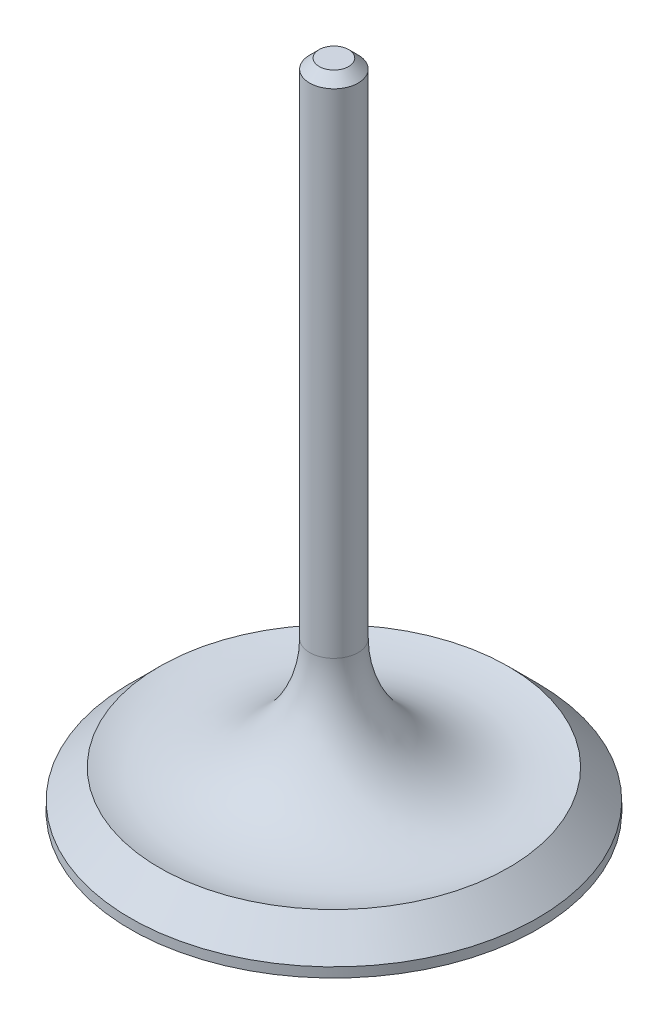
ISO-10303-21;
HEADER;
FILE_DESCRIPTION(('STEP AP214'),'2;1');
FILE_NAME('part.step','',(''),(''),'','','');
FILE_SCHEMA(('AUTOMOTIVE_DESIGN { 1 0 10303 214 1 1 1 1 }'));
ENDSEC;
DATA;
#1=APPLICATION_CONTEXT('core data for automotive mechanical design processes');
#2=APPLICATION_PROTOCOL_DEFINITION('international standard','automotive_design',2000,#1);
#3=PRODUCT_CONTEXT('',#1,'mechanical');
#4=PRODUCT('Part','Part','',(#3));
#5=PRODUCT_RELATED_PRODUCT_CATEGORY('part','',(#4));
#6=PRODUCT_DEFINITION_FORMATION('','',#4);
#7=PRODUCT_DEFINITION_CONTEXT('part definition',#1,'design');
#8=PRODUCT_DEFINITION('design','',#6,#7);
#9=PRODUCT_DEFINITION_SHAPE('','',#8);
#10=(LENGTH_UNIT() NAMED_UNIT(*) SI_UNIT(.MILLI.,.METRE.));
#11=(NAMED_UNIT(*) PLANE_ANGLE_UNIT() SI_UNIT($,.RADIAN.));
#12=(NAMED_UNIT(*) SI_UNIT($,.STERADIAN.) SOLID_ANGLE_UNIT());
#13=UNCERTAINTY_MEASURE_WITH_UNIT(LENGTH_MEASURE(1.E-05),#10,'distance_accuracy_value','');
#14=(GEOMETRIC_REPRESENTATION_CONTEXT(3) GLOBAL_UNCERTAINTY_ASSIGNED_CONTEXT((#13)) GLOBAL_UNIT_ASSIGNED_CONTEXT((#10,
#11,#12)) REPRESENTATION_CONTEXT('',''));
#15=CARTESIAN_POINT('',(0.,0.,0.));
#16=DIRECTION('',(0.,0.,1.));
#17=DIRECTION('',(1.,0.,0.));
#18=AXIS2_PLACEMENT_3D('',#15,#16,#17);
#19=CARTESIAN_POINT('',(0.,0.,-26.67));
#20=DIRECTION('',(0.,-1.,0.));
#21=DIRECTION('',(0.,0.,-1.));
#22=AXIS2_PLACEMENT_3D('',#19,#20,#21);
#23=PLANE('',#22);
#24=CARTESIAN_POINT('',(0.,0.,0.));
#25=DIRECTION('',(0.,-1.,0.));
#26=DIRECTION('',(0.,0.,-1.));
#27=AXIS2_PLACEMENT_3D('',#24,#25,#26);
#28=CIRCLE('',#27,26.67);
#29=CARTESIAN_POINT('',(0.,0.,-26.67));
#30=VERTEX_POINT('',#29);
#31=EDGE_CURVE('E45',#30,#30,#28,.T.);
#32=ORIENTED_EDGE('',*,*,#31,.T.);
#33=EDGE_LOOP('',(#32));
#34=FACE_BOUND('',#33,.T.);
#35=ADVANCED_FACE('F33',(#34),#23,.T.);
#36=CARTESIAN_POINT('',(0.,0.,0.));
#37=DIRECTION('',(0.,-1.,0.));
#38=DIRECTION('',(0.,0.,-1.));
#39=AXIS2_PLACEMENT_3D('',#36,#37,#38);
#40=CYLINDRICAL_SURFACE('',#39,26.67);
#41=CARTESIAN_POINT('',(0.,1.27,0.));
#42=DIRECTION('',(0.,-1.,0.));
#43=DIRECTION('',(0.,0.,-1.));
#44=AXIS2_PLACEMENT_3D('',#41,#42,#43);
#45=CIRCLE('',#44,26.67);
#46=CARTESIAN_POINT('',(0.,1.27,-26.67));
#47=VERTEX_POINT('',#46);
#48=EDGE_CURVE('E49',#47,#47,#45,.T.);
#49=ORIENTED_EDGE('',*,*,#48,.T.);
#50=EDGE_LOOP('',(#49));
#51=FACE_BOUND('',#50,.T.);
#52=ORIENTED_EDGE('',*,*,#31,.F.);
#53=EDGE_LOOP('',(#52));
#54=FACE_BOUND('',#53,.T.);
#55=ADVANCED_FACE('F76',(#51,#54),#40,.T.);
#56=CARTESIAN_POINT('',(0.,1.27,0.));
#57=DIRECTION('',(0.,-1.,0.));
#58=DIRECTION('',(0.,0.,-1.));
#59=AXIS2_PLACEMENT_3D('',#56,#57,#58);
#60=CONICAL_SURFACE('',#59,26.67,0.785398163397455);
#61=CARTESIAN_POINT('',(0.,5.08,0.));
#62=DIRECTION('',(0.,-1.,0.));
#63=DIRECTION('',(0.,0.,-1.));
#64=AXIS2_PLACEMENT_3D('',#61,#62,#63);
#65=CIRCLE('',#64,22.86);
#66=CARTESIAN_POINT('',(0.,5.08,-22.86));
#67=VERTEX_POINT('',#66);
#68=EDGE_CURVE('E54',#67,#67,#65,.T.);
#69=ORIENTED_EDGE('',*,*,#68,.T.);
#70=EDGE_LOOP('',(#69));
#71=FACE_BOUND('',#70,.T.);
#72=ORIENTED_EDGE('',*,*,#48,.F.);
#73=EDGE_LOOP('',(#72));
#74=FACE_BOUND('',#73,.T.);
#75=ADVANCED_FACE('F73',(#71,#74),#60,.T.);
#76=CARTESIAN_POINT('',(0.,19.6723815739584,0.));
#77=DIRECTION('',(0.,-1.,0.));
#78=DIRECTION('',(0.,0.,-1.));
#79=AXIS2_PLACEMENT_3D('',#76,#77,#78);
#80=TOROIDAL_SURFACE('',#79,18.43,15.25);
#81=CARTESIAN_POINT('',(0.,19.6723815739584,0.));
#82=DIRECTION('',(0.,-1.,0.));
#83=DIRECTION('',(0.,0.,-1.));
#84=AXIS2_PLACEMENT_3D('',#81,#82,#83);
#85=CIRCLE('',#84,3.18000000000001);
#86=CARTESIAN_POINT('',(0.,19.6723815739584,-3.18000000000001));
#87=VERTEX_POINT('',#86);
#88=EDGE_CURVE('E57',#87,#87,#85,.T.);
#89=ORIENTED_EDGE('',*,*,#88,.T.);
#90=EDGE_LOOP('',(#89));
#91=FACE_BOUND('',#90,.T.);
#92=ORIENTED_EDGE('',*,*,#68,.F.);
#93=EDGE_LOOP('',(#92));
#94=FACE_BOUND('',#93,.T.);
#95=ADVANCED_FACE('F61',(#91,#94),#80,.F.);
#96=CARTESIAN_POINT('',(0.,0.,0.));
#97=DIRECTION('',(0.,-1.,0.));
#98=DIRECTION('',(0.,0.,-1.));
#99=AXIS2_PLACEMENT_3D('',#96,#97,#98);
#100=CYLINDRICAL_SURFACE('',#99,3.18000000000001);
#101=CARTESIAN_POINT('',(0.,84.3,0.));
#102=DIRECTION('',(0.,1.,0.));
#103=DIRECTION('',(0.,0.,1.));
#104=AXIS2_PLACEMENT_3D('',#101,#102,#103);
#105=CIRCLE('',#104,3.18000000000001);
#106=CARTESIAN_POINT('',(0.,84.3,3.18000000000001));
#107=VERTEX_POINT('',#106);
#108=EDGE_CURVE('E41',#107,#107,#105,.F.);
#109=ORIENTED_EDGE('',*,*,#108,.T.);
#110=EDGE_LOOP('',(#109));
#111=FACE_BOUND('',#110,.T.);
#112=ORIENTED_EDGE('',*,*,#88,.F.);
#113=EDGE_LOOP('',(#112));
#114=FACE_BOUND('',#113,.T.);
#115=ADVANCED_FACE('F64',(#111,#114),#100,.T.);
#116=CARTESIAN_POINT('',(0.,85.55,0.));
#117=DIRECTION('',(0.,1.,0.));
#118=DIRECTION('',(0.,0.,1.));
#119=AXIS2_PLACEMENT_3D('',#116,#117,#118);
#120=PLANE('',#119);
#121=CARTESIAN_POINT('',(0.,85.55,0.));
#122=DIRECTION('',(0.,1.,0.));
#123=DIRECTION('',(0.,0.,1.));
#124=AXIS2_PLACEMENT_3D('',#121,#122,#123);
#125=CIRCLE('',#124,1.92999999999999);
#126=CARTESIAN_POINT('',(0.,85.55,1.92999999999999));
#127=VERTEX_POINT('',#126);
#128=EDGE_CURVE('E10',#127,#127,#125,.T.);
#129=ORIENTED_EDGE('',*,*,#128,.T.);
#130=EDGE_LOOP('',(#129));
#131=FACE_BOUND('',#130,.T.);
#132=ADVANCED_FACE('F66',(#131),#120,.T.);
#133=CARTESIAN_POINT('',(0.,84.3,0.));
#134=DIRECTION('',(0.,-1.,0.));
#135=DIRECTION('',(0.,0.,-1.));
#136=AXIS2_PLACEMENT_3D('',#133,#134,#135);
#137=CONICAL_SURFACE('',#136,3.18000000000001,0.785398163397444);
#138=ORIENTED_EDGE('',*,*,#128,.F.);
#139=EDGE_LOOP('',(#138));
#140=FACE_BOUND('',#139,.T.);
#141=ORIENTED_EDGE('',*,*,#108,.F.);
#142=EDGE_LOOP('',(#141));
#143=FACE_BOUND('',#142,.T.);
#144=ADVANCED_FACE('F36',(#140,#143),#137,.T.);
#145=CLOSED_SHELL('',(#35,#55,#75,#95,#115,#132,#144));
#146=MANIFOLD_SOLID_BREP('B2',#145);
#147=ADVANCED_BREP_SHAPE_REPRESENTATION('',(#18,#146),#14);
#148=SHAPE_DEFINITION_REPRESENTATION(#9,#147);
ENDSEC;
END-ISO-10303-21;
